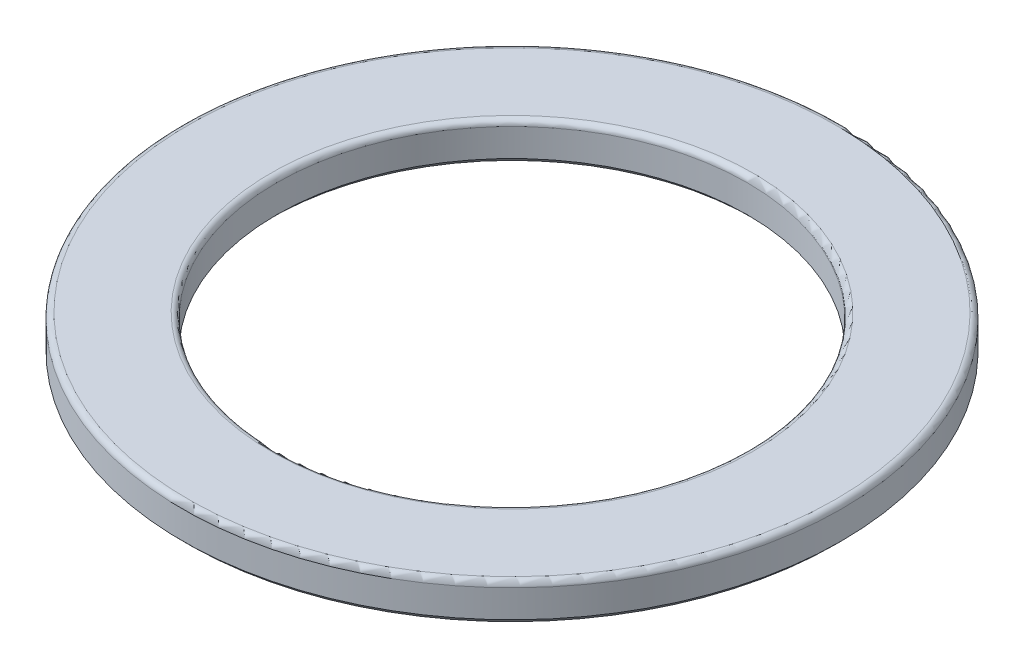
ISO-10303-21;
HEADER;
FILE_DESCRIPTION(('STEP AP214'),'2;1');
FILE_NAME('part.step','',(''),(''),'','','');
FILE_SCHEMA(('AUTOMOTIVE_DESIGN { 1 0 10303 214 1 1 1 1 }'));
ENDSEC;
DATA;
#1=APPLICATION_CONTEXT('core data for automotive mechanical design processes');
#2=APPLICATION_PROTOCOL_DEFINITION('international standard','automotive_design',2000,#1);
#3=PRODUCT_CONTEXT('',#1,'mechanical');
#4=PRODUCT('Part','Part','',(#3));
#5=PRODUCT_RELATED_PRODUCT_CATEGORY('part','',(#4));
#6=PRODUCT_DEFINITION_FORMATION('','',#4);
#7=PRODUCT_DEFINITION_CONTEXT('part definition',#1,'design');
#8=PRODUCT_DEFINITION('design','',#6,#7);
#9=PRODUCT_DEFINITION_SHAPE('','',#8);
#10=(LENGTH_UNIT() NAMED_UNIT(*) SI_UNIT(.MILLI.,.METRE.));
#11=(NAMED_UNIT(*) PLANE_ANGLE_UNIT() SI_UNIT($,.RADIAN.));
#12=(NAMED_UNIT(*) SI_UNIT($,.STERADIAN.) SOLID_ANGLE_UNIT());
#13=UNCERTAINTY_MEASURE_WITH_UNIT(LENGTH_MEASURE(1.E-05),#10,'distance_accuracy_value','');
#14=(GEOMETRIC_REPRESENTATION_CONTEXT(3) GLOBAL_UNCERTAINTY_ASSIGNED_CONTEXT((#13)) GLOBAL_UNIT_ASSIGNED_CONTEXT((#10,
#11,#12)) REPRESENTATION_CONTEXT('',''));
#15=CARTESIAN_POINT('',(0.,0.,0.));
#16=DIRECTION('',(0.,0.,1.));
#17=DIRECTION('',(1.,0.,0.));
#18=AXIS2_PLACEMENT_3D('',#15,#16,#17);
#19=CARTESIAN_POINT('',(30.,14.,0.));
#20=DIRECTION('',(0.,1.,0.));
#21=DIRECTION('',(-1.,0.,0.));
#22=AXIS2_PLACEMENT_3D('',#19,#20,#21);
#23=PLANE('',#22);
#24=CARTESIAN_POINT('',(0.,14.,0.));
#25=DIRECTION('',(0.,-1.,0.));
#26=DIRECTION('',(1.,0.,0.));
#27=AXIS2_PLACEMENT_3D('',#24,#25,#26);
#28=CIRCLE('',#27,25.6);
#29=CARTESIAN_POINT('',(25.6,14.,0.));
#30=VERTEX_POINT('',#29);
#31=EDGE_CURVE('E11',#30,#30,#28,.T.);
#32=ORIENTED_EDGE('',*,*,#31,.T.);
#33=EDGE_LOOP('',(#32));
#34=FACE_BOUND('',#33,.T.);
#35=CARTESIAN_POINT('',(0.,14.,0.));
#36=DIRECTION('',(0.,-1.,0.));
#37=DIRECTION('',(1.,0.,0.));
#38=AXIS2_PLACEMENT_3D('',#35,#36,#37);
#39=CIRCLE('',#38,34.4);
#40=CARTESIAN_POINT('',(34.4,14.,0.));
#41=VERTEX_POINT('',#40);
#42=EDGE_CURVE('E71',#41,#41,#39,.T.);
#43=ORIENTED_EDGE('',*,*,#42,.F.);
#44=EDGE_LOOP('',(#43));
#45=FACE_BOUND('',#44,.T.);
#46=ADVANCED_FACE('F17',(#34,#45),#23,.T.);
#47=CARTESIAN_POINT('',(0.,13.4,0.));
#48=DIRECTION('',(0.,-1.,0.));
#49=DIRECTION('',(0.,0.,-1.));
#50=AXIS2_PLACEMENT_3D('',#47,#48,#49);
#51=TOROIDAL_SURFACE('',#50,25.6,0.6);
#52=CARTESIAN_POINT('',(0.,13.4,0.));
#53=DIRECTION('',(0.,-1.,0.));
#54=DIRECTION('',(1.,0.,0.));
#55=AXIS2_PLACEMENT_3D('',#52,#53,#54);
#56=CIRCLE('',#55,25.);
#57=CARTESIAN_POINT('',(25.,13.4,0.));
#58=VERTEX_POINT('',#57);
#59=EDGE_CURVE('E26',#58,#58,#56,.T.);
#60=ORIENTED_EDGE('',*,*,#59,.T.);
#61=EDGE_LOOP('',(#60));
#62=FACE_BOUND('',#61,.T.);
#63=ORIENTED_EDGE('',*,*,#31,.F.);
#64=EDGE_LOOP('',(#63));
#65=FACE_BOUND('',#64,.T.);
#66=ADVANCED_FACE('F91',(#62,#65),#51,.T.);
#67=CARTESIAN_POINT('',(0.,11.9288,0.));
#68=DIRECTION('',(0.,1.,0.));
#69=DIRECTION('',(1.,0.,0.));
#70=AXIS2_PLACEMENT_3D('',#67,#68,#69);
#71=CYLINDRICAL_SURFACE('',#70,25.);
#72=CARTESIAN_POINT('',(0.,10.4576,0.));
#73=DIRECTION('',(0.,-1.,0.));
#74=DIRECTION('',(1.,0.,0.));
#75=AXIS2_PLACEMENT_3D('',#72,#73,#74);
#76=CIRCLE('',#75,25.);
#77=CARTESIAN_POINT('',(25.,10.4576,0.));
#78=VERTEX_POINT('',#77);
#79=EDGE_CURVE('E59',#78,#78,#76,.T.);
#80=ORIENTED_EDGE('',*,*,#79,.T.);
#81=EDGE_LOOP('',(#80));
#82=FACE_BOUND('',#81,.T.);
#83=ORIENTED_EDGE('',*,*,#59,.F.);
#84=EDGE_LOOP('',(#83));
#85=FACE_BOUND('',#84,.T.);
#86=ADVANCED_FACE('F95',(#82,#85),#71,.F.);
#87=CARTESIAN_POINT('',(0.,10.1576,0.));
#88=DIRECTION('',(0.,-1.,0.));
#89=DIRECTION('',(1.,0.,0.));
#90=AXIS2_PLACEMENT_3D('',#87,#88,#89);
#91=CONICAL_SURFACE('',#90,25.3,0.785398163397443);
#92=CARTESIAN_POINT('',(0.,9.8576,0.));
#93=DIRECTION('',(0.,-1.,0.));
#94=DIRECTION('',(1.,0.,0.));
#95=AXIS2_PLACEMENT_3D('',#92,#93,#94);
#96=CIRCLE('',#95,25.6);
#97=CARTESIAN_POINT('',(25.6,9.8576,0.));
#98=VERTEX_POINT('',#97);
#99=EDGE_CURVE('E20',#98,#98,#96,.T.);
#100=ORIENTED_EDGE('',*,*,#99,.T.);
#101=EDGE_LOOP('',(#100));
#102=FACE_BOUND('',#101,.T.);
#103=ORIENTED_EDGE('',*,*,#79,.F.);
#104=EDGE_LOOP('',(#103));
#105=FACE_BOUND('',#104,.T.);
#106=ADVANCED_FACE('F56',(#102,#105),#91,.F.);
#107=CARTESIAN_POINT('',(26.7284,9.8576,0.));
#108=DIRECTION('',(0.,-1.,0.));
#109=DIRECTION('',(1.,0.,0.));
#110=AXIS2_PLACEMENT_3D('',#107,#108,#109);
#111=PLANE('',#110);
#112=CARTESIAN_POINT('',(0.,9.8576,0.));
#113=DIRECTION('',(0.,-1.,0.));
#114=DIRECTION('',(1.,0.,0.));
#115=AXIS2_PLACEMENT_3D('',#112,#113,#114);
#116=CIRCLE('',#115,27.8568);
#117=CARTESIAN_POINT('',(27.8568,9.8576,0.));
#118=VERTEX_POINT('',#117);
#119=EDGE_CURVE('E60',#118,#118,#116,.T.);
#120=ORIENTED_EDGE('',*,*,#119,.T.);
#121=EDGE_LOOP('',(#120));
#122=FACE_BOUND('',#121,.T.);
#123=ORIENTED_EDGE('',*,*,#99,.F.);
#124=EDGE_LOOP('',(#123));
#125=FACE_BOUND('',#124,.T.);
#126=ADVANCED_FACE('F112',(#122,#125),#111,.T.);
#127=CARTESIAN_POINT('',(0.,7.,0.));
#128=DIRECTION('',(0.,-1.,0.));
#129=DIRECTION('',(0.,0.,-1.));
#130=AXIS2_PLACEMENT_3D('',#127,#128,#129);
#131=TOROIDAL_SURFACE('',#130,30.,3.572);
#132=CARTESIAN_POINT('',(0.,9.8576,0.));
#133=DIRECTION('',(0.,-1.,0.));
#134=DIRECTION('',(1.,0.,0.));
#135=AXIS2_PLACEMENT_3D('',#132,#133,#134);
#136=CIRCLE('',#135,32.1432);
#137=CARTESIAN_POINT('',(32.1432,9.8576,0.));
#138=VERTEX_POINT('',#137);
#139=EDGE_CURVE('E61',#138,#138,#136,.T.);
#140=ORIENTED_EDGE('',*,*,#139,.T.);
#141=EDGE_LOOP('',(#140));
#142=FACE_BOUND('',#141,.T.);
#143=ORIENTED_EDGE('',*,*,#119,.F.);
#144=EDGE_LOOP('',(#143));
#145=FACE_BOUND('',#144,.T.);
#146=ADVANCED_FACE('F109',(#142,#145),#131,.F.);
#147=CARTESIAN_POINT('',(33.2716,9.8576,0.));
#148=DIRECTION('',(0.,-1.,0.));
#149=DIRECTION('',(1.,0.,0.));
#150=AXIS2_PLACEMENT_3D('',#147,#148,#149);
#151=PLANE('',#150);
#152=CARTESIAN_POINT('',(0.,9.8576,0.));
#153=DIRECTION('',(0.,-1.,0.));
#154=DIRECTION('',(1.,0.,0.));
#155=AXIS2_PLACEMENT_3D('',#152,#153,#154);
#156=CIRCLE('',#155,34.4);
#157=CARTESIAN_POINT('',(34.4,9.8576,0.));
#158=VERTEX_POINT('',#157);
#159=EDGE_CURVE('E65',#158,#158,#156,.T.);
#160=ORIENTED_EDGE('',*,*,#159,.T.);
#161=EDGE_LOOP('',(#160));
#162=FACE_BOUND('',#161,.T.);
#163=ORIENTED_EDGE('',*,*,#139,.F.);
#164=EDGE_LOOP('',(#163));
#165=FACE_BOUND('',#164,.T.);
#166=ADVANCED_FACE('F106',(#162,#165),#151,.T.);
#167=CARTESIAN_POINT('',(0.,10.1576,0.));
#168=DIRECTION('',(0.,1.,0.));
#169=DIRECTION('',(1.,0.,0.));
#170=AXIS2_PLACEMENT_3D('',#167,#168,#169);
#171=CONICAL_SURFACE('',#170,34.7,0.78539816339745);
#172=CARTESIAN_POINT('',(0.,10.4576,0.));
#173=DIRECTION('',(0.,-1.,0.));
#174=DIRECTION('',(1.,0.,0.));
#175=AXIS2_PLACEMENT_3D('',#172,#173,#174);
#176=CIRCLE('',#175,35.);
#177=CARTESIAN_POINT('',(35.,10.4576,0.));
#178=VERTEX_POINT('',#177);
#179=EDGE_CURVE('E68',#178,#178,#176,.T.);
#180=ORIENTED_EDGE('',*,*,#179,.T.);
#181=EDGE_LOOP('',(#180));
#182=FACE_BOUND('',#181,.T.);
#183=ORIENTED_EDGE('',*,*,#159,.F.);
#184=EDGE_LOOP('',(#183));
#185=FACE_BOUND('',#184,.T.);
#186=ADVANCED_FACE('F87',(#182,#185),#171,.T.);
#187=CARTESIAN_POINT('',(0.,11.9288,0.));
#188=DIRECTION('',(0.,1.,0.));
#189=DIRECTION('',(1.,0.,0.));
#190=AXIS2_PLACEMENT_3D('',#187,#188,#189);
#191=CYLINDRICAL_SURFACE('',#190,35.);
#192=CARTESIAN_POINT('',(0.,13.4,0.));
#193=DIRECTION('',(0.,-1.,0.));
#194=DIRECTION('',(1.,0.,0.));
#195=AXIS2_PLACEMENT_3D('',#192,#193,#194);
#196=CIRCLE('',#195,35.);
#197=CARTESIAN_POINT('',(35.,13.4,0.));
#198=VERTEX_POINT('',#197);
#199=EDGE_CURVE('E72',#198,#198,#196,.T.);
#200=ORIENTED_EDGE('',*,*,#199,.T.);
#201=EDGE_LOOP('',(#200));
#202=FACE_BOUND('',#201,.T.);
#203=ORIENTED_EDGE('',*,*,#179,.F.);
#204=EDGE_LOOP('',(#203));
#205=FACE_BOUND('',#204,.T.);
#206=ADVANCED_FACE('F77',(#202,#205),#191,.T.);
#207=CARTESIAN_POINT('',(0.,13.4,0.));
#208=DIRECTION('',(0.,-1.,0.));
#209=DIRECTION('',(0.,0.,-1.));
#210=AXIS2_PLACEMENT_3D('',#207,#208,#209);
#211=TOROIDAL_SURFACE('',#210,34.4,0.6);
#212=ORIENTED_EDGE('',*,*,#42,.T.);
#213=EDGE_LOOP('',(#212));
#214=FACE_BOUND('',#213,.T.);
#215=ORIENTED_EDGE('',*,*,#199,.F.);
#216=EDGE_LOOP('',(#215));
#217=FACE_BOUND('',#216,.T.);
#218=ADVANCED_FACE('F80',(#214,#217),#211,.T.);
#219=CLOSED_SHELL('',(#46,#66,#86,#106,#126,#146,#166,#186,#206,#218));
#220=MANIFOLD_SOLID_BREP('B1',#219);
#221=ADVANCED_BREP_SHAPE_REPRESENTATION('',(#18,#220),#14);
#222=SHAPE_DEFINITION_REPRESENTATION(#9,#221);
ENDSEC;
END-ISO-10303-21;
